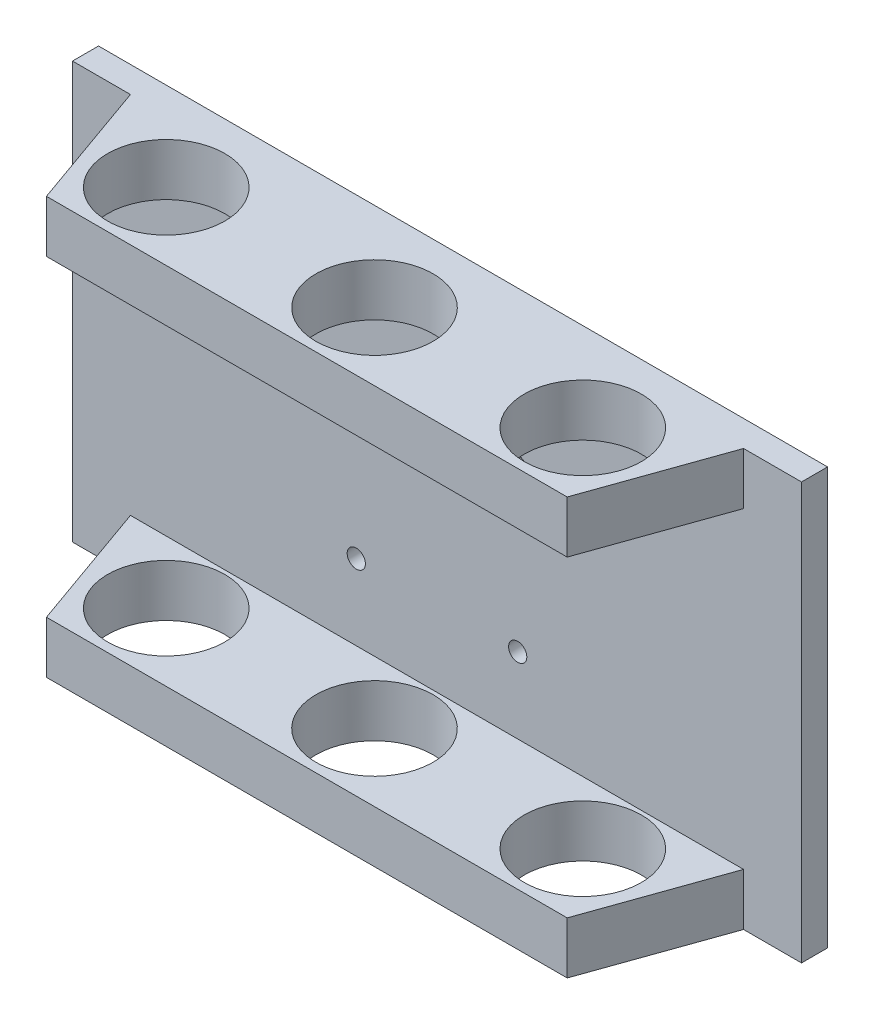
ISO-10303-21;
HEADER;
FILE_DESCRIPTION(('STEP AP214'),'2;1');
FILE_NAME('part.step','',(''),(''),'','','');
FILE_SCHEMA(('AUTOMOTIVE_DESIGN { 1 0 10303 214 1 1 1 1 }'));
ENDSEC;
DATA;
#1=APPLICATION_CONTEXT('core data for automotive mechanical design processes');
#2=APPLICATION_PROTOCOL_DEFINITION('international standard','automotive_design',2000,#1);
#3=PRODUCT_CONTEXT('',#1,'mechanical');
#4=PRODUCT('Part','Part','',(#3));
#5=PRODUCT_RELATED_PRODUCT_CATEGORY('part','',(#4));
#6=PRODUCT_DEFINITION_FORMATION('','',#4);
#7=PRODUCT_DEFINITION_CONTEXT('part definition',#1,'design');
#8=PRODUCT_DEFINITION('design','',#6,#7);
#9=PRODUCT_DEFINITION_SHAPE('','',#8);
#10=(LENGTH_UNIT() NAMED_UNIT(*) SI_UNIT(.MILLI.,.METRE.));
#11=(NAMED_UNIT(*) PLANE_ANGLE_UNIT() SI_UNIT($,.RADIAN.));
#12=(NAMED_UNIT(*) SI_UNIT($,.STERADIAN.) SOLID_ANGLE_UNIT());
#13=UNCERTAINTY_MEASURE_WITH_UNIT(LENGTH_MEASURE(1.E-05),#10,'distance_accuracy_value','');
#14=(GEOMETRIC_REPRESENTATION_CONTEXT(3) GLOBAL_UNCERTAINTY_ASSIGNED_CONTEXT((#13)) GLOBAL_UNIT_ASSIGNED_CONTEXT((#10,
#11,#12)) REPRESENTATION_CONTEXT('',''));
#15=CARTESIAN_POINT('',(0.,0.,0.));
#16=DIRECTION('',(0.,0.,1.));
#17=DIRECTION('',(1.,0.,0.));
#18=AXIS2_PLACEMENT_3D('',#15,#16,#17);
#19=CARTESIAN_POINT('',(-58.8704428508277,40.,2.5));
#20=DIRECTION('',(0.942433981333978,0.,-0.334392270884043));
#21=DIRECTION('',(-0.334392270884043,0.,-0.942433981333978));
#22=AXIS2_PLACEMENT_3D('',#19,#20,#21);
#23=PLANE('',#22);
#24=DIRECTION('',(0.,-1.,0.));
#25=VECTOR('',#24,1.);
#26=CARTESIAN_POINT('',(-58.8704428508277,40.,2.5));
#27=LINE('',#26,#25);
#28=CARTESIAN_POINT('',(-58.8704428508277,40.,2.5));
#29=VERTEX_POINT('',#28);
#30=CARTESIAN_POINT('',(-58.8704428508277,30.,2.5));
#31=VERTEX_POINT('',#30);
#32=EDGE_CURVE('E183',#29,#31,#27,.T.);
#33=ORIENTED_EDGE('',*,*,#32,.T.);
#34=DIRECTION('',(0.334392270884043,0.,0.942433981333978));
#35=VECTOR('',#34,1.);
#36=CARTESIAN_POINT('',(-58.8704428508277,30.,2.5));
#37=LINE('',#36,#35);
#38=CARTESIAN_POINT('',(-50.,30.,27.5));
#39=VERTEX_POINT('',#38);
#40=EDGE_CURVE('E238',#31,#39,#37,.T.);
#41=ORIENTED_EDGE('',*,*,#40,.T.);
#42=DIRECTION('',(0.,-1.,0.));
#43=VECTOR('',#42,1.);
#44=CARTESIAN_POINT('',(-50.,40.,27.5));
#45=LINE('',#44,#43);
#46=CARTESIAN_POINT('',(-50.,40.,27.5));
#47=VERTEX_POINT('',#46);
#48=EDGE_CURVE('E180',#47,#39,#45,.T.);
#49=ORIENTED_EDGE('',*,*,#48,.F.);
#50=DIRECTION('',(0.334392270884043,0.,0.942433981333978));
#51=VECTOR('',#50,1.);
#52=CARTESIAN_POINT('',(-58.8704428508277,40.,2.5));
#53=LINE('',#52,#51);
#54=EDGE_CURVE('E130',#29,#47,#53,.T.);
#55=ORIENTED_EDGE('',*,*,#54,.F.);
#56=EDGE_LOOP('',(#33,#41,#49,#55));
#57=FACE_BOUND('',#56,.T.);
#58=ADVANCED_FACE('F41',(#57),#23,.F.);
#59=CARTESIAN_POINT('',(50.,40.,27.5));
#60=DIRECTION('',(0.,0.,-1.));
#61=DIRECTION('',(-1.,0.,0.));
#62=AXIS2_PLACEMENT_3D('',#59,#60,#61);
#63=PLANE('',#62);
#64=ORIENTED_EDGE('',*,*,#48,.T.);
#65=DIRECTION('',(-1.,0.,0.));
#66=VECTOR('',#65,1.);
#67=CARTESIAN_POINT('',(70.,30.,27.5));
#68=LINE('',#67,#66);
#69=CARTESIAN_POINT('',(50.,30.,27.5));
#70=VERTEX_POINT('',#69);
#71=EDGE_CURVE('E141',#70,#39,#68,.T.);
#72=ORIENTED_EDGE('',*,*,#71,.F.);
#73=DIRECTION('',(0.,-1.,0.));
#74=VECTOR('',#73,1.);
#75=CARTESIAN_POINT('',(50.,40.,27.5));
#76=LINE('',#75,#74);
#77=CARTESIAN_POINT('',(50.,40.,27.5));
#78=VERTEX_POINT('',#77);
#79=EDGE_CURVE('E137',#78,#70,#76,.T.);
#80=ORIENTED_EDGE('',*,*,#79,.F.);
#81=DIRECTION('',(1.,0.,0.));
#82=VECTOR('',#81,1.);
#83=CARTESIAN_POINT('',(50.,40.,27.5));
#84=LINE('',#83,#82);
#85=EDGE_CURVE('E122',#47,#78,#84,.T.);
#86=ORIENTED_EDGE('',*,*,#85,.F.);
#87=EDGE_LOOP('',(#64,#72,#80,#86));
#88=FACE_BOUND('',#87,.T.);
#89=ADVANCED_FACE('F138',(#88),#63,.F.);
#90=CARTESIAN_POINT('',(58.8704428508277,40.,2.5));
#91=DIRECTION('',(-0.942433981333978,0.,-0.334392270884043));
#92=DIRECTION('',(-0.334392270884043,0.,0.942433981333978));
#93=AXIS2_PLACEMENT_3D('',#90,#91,#92);
#94=PLANE('',#93);
#95=ORIENTED_EDGE('',*,*,#79,.T.);
#96=DIRECTION('',(0.334392270884043,0.,-0.942433981333978));
#97=VECTOR('',#96,1.);
#98=CARTESIAN_POINT('',(58.8704428508277,30.,2.5));
#99=LINE('',#98,#97);
#100=CARTESIAN_POINT('',(58.8704428508277,30.,2.5));
#101=VERTEX_POINT('',#100);
#102=EDGE_CURVE('E236',#70,#101,#99,.T.);
#103=ORIENTED_EDGE('',*,*,#102,.T.);
#104=DIRECTION('',(0.,-1.,0.));
#105=VECTOR('',#104,1.);
#106=CARTESIAN_POINT('',(58.8704428508277,40.,2.5));
#107=LINE('',#106,#105);
#108=CARTESIAN_POINT('',(58.8704428508277,40.,2.5));
#109=VERTEX_POINT('',#108);
#110=EDGE_CURVE('E149',#109,#101,#107,.T.);
#111=ORIENTED_EDGE('',*,*,#110,.F.);
#112=DIRECTION('',(0.334392270884043,0.,-0.942433981333978));
#113=VECTOR('',#112,1.);
#114=CARTESIAN_POINT('',(58.8704428508277,40.,2.5));
#115=LINE('',#114,#113);
#116=EDGE_CURVE('E127',#78,#109,#115,.T.);
#117=ORIENTED_EDGE('',*,*,#116,.F.);
#118=EDGE_LOOP('',(#95,#103,#111,#117));
#119=FACE_BOUND('',#118,.T.);
#120=ADVANCED_FACE('F147',(#119),#94,.F.);
#121=CARTESIAN_POINT('',(0.,40.,14.5));
#122=DIRECTION('',(0.,-1.,0.));
#123=DIRECTION('',(0.,0.,-1.));
#124=AXIS2_PLACEMENT_3D('',#121,#122,#123);
#125=CYLINDRICAL_SURFACE('',#124,11.25);
#126=CARTESIAN_POINT('',(0.,30.,14.5));
#127=DIRECTION('',(0.,1.,0.));
#128=DIRECTION('',(0.,0.,1.));
#129=AXIS2_PLACEMENT_3D('',#126,#127,#128);
#130=CIRCLE('',#129,11.25);
#131=CARTESIAN_POINT('',(0.,30.,25.75));
#132=VERTEX_POINT('',#131);
#133=EDGE_CURVE('E233',#132,#132,#130,.T.);
#134=ORIENTED_EDGE('',*,*,#133,.F.);
#135=EDGE_LOOP('',(#134));
#136=FACE_BOUND('',#135,.T.);
#137=CARTESIAN_POINT('',(0.,40.,14.5));
#138=DIRECTION('',(0.,1.,0.));
#139=DIRECTION('',(0.,0.,1.));
#140=AXIS2_PLACEMENT_3D('',#137,#138,#139);
#141=CIRCLE('',#140,11.25);
#142=CARTESIAN_POINT('',(0.,40.,25.75));
#143=VERTEX_POINT('',#142);
#144=EDGE_CURVE('E157',#143,#143,#141,.T.);
#145=ORIENTED_EDGE('',*,*,#144,.T.);
#146=EDGE_LOOP('',(#145));
#147=FACE_BOUND('',#146,.T.);
#148=ADVANCED_FACE('F359',(#136,#147),#125,.F.);
#149=CARTESIAN_POINT('',(40.,40.,14.5));
#150=DIRECTION('',(0.,-1.,0.));
#151=DIRECTION('',(0.,0.,-1.));
#152=AXIS2_PLACEMENT_3D('',#149,#150,#151);
#153=CYLINDRICAL_SURFACE('',#152,11.25);
#154=CARTESIAN_POINT('',(40.,30.,14.5));
#155=DIRECTION('',(0.,1.,0.));
#156=DIRECTION('',(0.,0.,1.));
#157=AXIS2_PLACEMENT_3D('',#154,#155,#156);
#158=CIRCLE('',#157,11.25);
#159=CARTESIAN_POINT('',(40.,30.,25.75));
#160=VERTEX_POINT('',#159);
#161=EDGE_CURVE('E197',#160,#160,#158,.T.);
#162=ORIENTED_EDGE('',*,*,#161,.F.);
#163=EDGE_LOOP('',(#162));
#164=FACE_BOUND('',#163,.T.);
#165=CARTESIAN_POINT('',(40.,40.,14.5));
#166=DIRECTION('',(0.,1.,0.));
#167=DIRECTION('',(0.,0.,1.));
#168=AXIS2_PLACEMENT_3D('',#165,#166,#167);
#169=CIRCLE('',#168,11.25);
#170=CARTESIAN_POINT('',(40.,40.,25.75));
#171=VERTEX_POINT('',#170);
#172=EDGE_CURVE('E248',#171,#171,#169,.T.);
#173=ORIENTED_EDGE('',*,*,#172,.T.);
#174=EDGE_LOOP('',(#173));
#175=FACE_BOUND('',#174,.T.);
#176=ADVANCED_FACE('F364',(#164,#175),#153,.F.);
#177=CARTESIAN_POINT('',(-40.,40.,14.5));
#178=DIRECTION('',(0.,-1.,0.));
#179=DIRECTION('',(0.,0.,-1.));
#180=AXIS2_PLACEMENT_3D('',#177,#178,#179);
#181=CYLINDRICAL_SURFACE('',#180,11.25);
#182=CARTESIAN_POINT('',(-40.,30.,14.5));
#183=DIRECTION('',(0.,1.,0.));
#184=DIRECTION('',(0.,0.,1.));
#185=AXIS2_PLACEMENT_3D('',#182,#183,#184);
#186=CIRCLE('',#185,11.25);
#187=CARTESIAN_POINT('',(-40.,30.,25.75));
#188=VERTEX_POINT('',#187);
#189=EDGE_CURVE('E194',#188,#188,#186,.T.);
#190=ORIENTED_EDGE('',*,*,#189,.F.);
#191=EDGE_LOOP('',(#190));
#192=FACE_BOUND('',#191,.T.);
#193=CARTESIAN_POINT('',(-40.,40.,14.5));
#194=DIRECTION('',(0.,1.,0.));
#195=DIRECTION('',(0.,0.,-1.));
#196=AXIS2_PLACEMENT_3D('',#193,#194,#195);
#197=CIRCLE('',#196,11.25);
#198=CARTESIAN_POINT('',(-40.,40.,3.24999999999998));
#199=VERTEX_POINT('',#198);
#200=EDGE_CURVE('E242',#199,#199,#197,.T.);
#201=ORIENTED_EDGE('',*,*,#200,.T.);
#202=EDGE_LOOP('',(#201));
#203=FACE_BOUND('',#202,.T.);
#204=ADVANCED_FACE('F354',(#192,#203),#181,.F.);
#205=CARTESIAN_POINT('',(0.,40.,0.));
#206=DIRECTION('',(0.,-1.,0.));
#207=DIRECTION('',(0.,0.,-1.));
#208=AXIS2_PLACEMENT_3D('',#205,#206,#207);
#209=PLANE('',#208);
#210=DIRECTION('',(0.,0.,-1.));
#211=VECTOR('',#210,1.);
#212=CARTESIAN_POINT('',(70.,40.,2.5));
#213=LINE('',#212,#211);
#214=CARTESIAN_POINT('',(70.,40.,2.5));
#215=VERTEX_POINT('',#214);
#216=CARTESIAN_POINT('',(70.,40.,-2.5));
#217=VERTEX_POINT('',#216);
#218=EDGE_CURVE('E176',#215,#217,#213,.T.);
#219=ORIENTED_EDGE('',*,*,#218,.T.);
#220=DIRECTION('',(-1.,0.,0.));
#221=VECTOR('',#220,1.);
#222=CARTESIAN_POINT('',(-70.,40.,-2.5));
#223=LINE('',#222,#221);
#224=CARTESIAN_POINT('',(-70.,40.,-2.5));
#225=VERTEX_POINT('',#224);
#226=EDGE_CURVE('E107',#217,#225,#223,.T.);
#227=ORIENTED_EDGE('',*,*,#226,.T.);
#228=DIRECTION('',(0.,0.,1.));
#229=VECTOR('',#228,1.);
#230=CARTESIAN_POINT('',(-70.,40.,2.5));
#231=LINE('',#230,#229);
#232=CARTESIAN_POINT('',(-70.,40.,2.5));
#233=VERTEX_POINT('',#232);
#234=EDGE_CURVE('E260',#225,#233,#231,.T.);
#235=ORIENTED_EDGE('',*,*,#234,.T.);
#236=DIRECTION('',(1.,0.,0.));
#237=VECTOR('',#236,1.);
#238=CARTESIAN_POINT('',(-70.,40.,2.5));
#239=LINE('',#238,#237);
#240=EDGE_CURVE('E262',#233,#29,#239,.T.);
#241=ORIENTED_EDGE('',*,*,#240,.T.);
#242=ORIENTED_EDGE('',*,*,#54,.T.);
#243=ORIENTED_EDGE('',*,*,#85,.T.);
#244=ORIENTED_EDGE('',*,*,#116,.T.);
#245=DIRECTION('',(1.,0.,0.));
#246=VECTOR('',#245,1.);
#247=CARTESIAN_POINT('',(58.8704428508277,40.,2.5));
#248=LINE('',#247,#246);
#249=EDGE_CURVE('E67',#109,#215,#248,.T.);
#250=ORIENTED_EDGE('',*,*,#249,.T.);
#251=EDGE_LOOP('',(#219,#227,#235,#241,#242,#243,#244,#250));
#252=FACE_BOUND('',#251,.T.);
#253=ORIENTED_EDGE('',*,*,#144,.F.);
#254=EDGE_LOOP('',(#253));
#255=FACE_BOUND('',#254,.T.);
#256=ORIENTED_EDGE('',*,*,#172,.F.);
#257=EDGE_LOOP('',(#256));
#258=FACE_BOUND('',#257,.T.);
#259=ORIENTED_EDGE('',*,*,#200,.F.);
#260=EDGE_LOOP('',(#259));
#261=FACE_BOUND('',#260,.T.);
#262=ADVANCED_FACE('F124',(#252,#255,#258,#261),#209,.F.);
#263=CARTESIAN_POINT('',(0.,-40.,0.));
#264=DIRECTION('',(0.,-1.,0.));
#265=DIRECTION('',(0.,0.,-1.));
#266=AXIS2_PLACEMENT_3D('',#263,#264,#265);
#267=PLANE('',#266);
#268=CARTESIAN_POINT('',(40.,-40.,14.5));
#269=DIRECTION('',(0.,1.,0.));
#270=DIRECTION('',(0.,0.,1.));
#271=AXIS2_PLACEMENT_3D('',#268,#269,#270);
#272=CIRCLE('',#271,11.25);
#273=CARTESIAN_POINT('',(40.,-40.,25.75));
#274=VERTEX_POINT('',#273);
#275=EDGE_CURVE('E245',#274,#274,#272,.T.);
#276=ORIENTED_EDGE('',*,*,#275,.T.);
#277=EDGE_LOOP('',(#276));
#278=FACE_BOUND('',#277,.T.);
#279=DIRECTION('',(0.,0.,-1.));
#280=VECTOR('',#279,1.);
#281=CARTESIAN_POINT('',(70.,-40.,2.5));
#282=LINE('',#281,#280);
#283=CARTESIAN_POINT('',(70.,-40.,2.5));
#284=VERTEX_POINT('',#283);
#285=CARTESIAN_POINT('',(70.,-40.,-2.5));
#286=VERTEX_POINT('',#285);
#287=EDGE_CURVE('E154',#284,#286,#282,.T.);
#288=ORIENTED_EDGE('',*,*,#287,.F.);
#289=DIRECTION('',(1.,0.,0.));
#290=VECTOR('',#289,1.);
#291=CARTESIAN_POINT('',(58.8704428508277,-40.,2.5));
#292=LINE('',#291,#290);
#293=CARTESIAN_POINT('',(58.8704428508277,-40.,2.5));
#294=VERTEX_POINT('',#293);
#295=EDGE_CURVE('E174',#294,#284,#292,.T.);
#296=ORIENTED_EDGE('',*,*,#295,.F.);
#297=DIRECTION('',(0.334392270884043,0.,-0.942433981333978));
#298=VECTOR('',#297,1.);
#299=CARTESIAN_POINT('',(58.8704428508277,-40.,2.5));
#300=LINE('',#299,#298);
#301=CARTESIAN_POINT('',(50.,-40.,27.5));
#302=VERTEX_POINT('',#301);
#303=EDGE_CURVE('E171',#302,#294,#300,.T.);
#304=ORIENTED_EDGE('',*,*,#303,.F.);
#305=DIRECTION('',(1.,0.,0.));
#306=VECTOR('',#305,1.);
#307=CARTESIAN_POINT('',(50.,-40.,27.5));
#308=LINE('',#307,#306);
#309=CARTESIAN_POINT('',(-50.,-40.,27.5));
#310=VERTEX_POINT('',#309);
#311=EDGE_CURVE('E168',#310,#302,#308,.T.);
#312=ORIENTED_EDGE('',*,*,#311,.F.);
#313=DIRECTION('',(0.334392270884043,0.,0.942433981333978));
#314=VECTOR('',#313,1.);
#315=CARTESIAN_POINT('',(-58.8704428508277,-40.,2.5));
#316=LINE('',#315,#314);
#317=CARTESIAN_POINT('',(-58.8704428508277,-40.,2.5));
#318=VERTEX_POINT('',#317);
#319=EDGE_CURVE('E165',#318,#310,#316,.T.);
#320=ORIENTED_EDGE('',*,*,#319,.F.);
#321=DIRECTION('',(1.,0.,0.));
#322=VECTOR('',#321,1.);
#323=CARTESIAN_POINT('',(-70.,-40.,2.5));
#324=LINE('',#323,#322);
#325=CARTESIAN_POINT('',(-70.,-40.,2.5));
#326=VERTEX_POINT('',#325);
#327=EDGE_CURVE('E162',#326,#318,#324,.T.);
#328=ORIENTED_EDGE('',*,*,#327,.F.);
#329=DIRECTION('',(0.,0.,1.));
#330=VECTOR('',#329,1.);
#331=CARTESIAN_POINT('',(-70.,-40.,2.5));
#332=LINE('',#331,#330);
#333=CARTESIAN_POINT('',(-70.,-40.,-2.5));
#334=VERTEX_POINT('',#333);
#335=EDGE_CURVE('E159',#334,#326,#332,.T.);
#336=ORIENTED_EDGE('',*,*,#335,.F.);
#337=DIRECTION('',(-1.,0.,0.));
#338=VECTOR('',#337,1.);
#339=CARTESIAN_POINT('',(-70.,-40.,-2.5));
#340=LINE('',#339,#338);
#341=EDGE_CURVE('E156',#286,#334,#340,.T.);
#342=ORIENTED_EDGE('',*,*,#341,.F.);
#343=EDGE_LOOP('',(#288,#296,#304,#312,#320,#328,#336,#342));
#344=FACE_BOUND('',#343,.T.);
#345=CARTESIAN_POINT('',(0.,-40.,14.5));
#346=DIRECTION('',(0.,1.,0.));
#347=DIRECTION('',(0.,0.,1.));
#348=AXIS2_PLACEMENT_3D('',#345,#346,#347);
#349=CIRCLE('',#348,11.25);
#350=CARTESIAN_POINT('',(0.,-40.,25.75));
#351=VERTEX_POINT('',#350);
#352=EDGE_CURVE('E251',#351,#351,#349,.T.);
#353=ORIENTED_EDGE('',*,*,#352,.T.);
#354=EDGE_LOOP('',(#353));
#355=FACE_BOUND('',#354,.T.);
#356=CARTESIAN_POINT('',(-40.,-40.,14.5));
#357=DIRECTION('',(0.,1.,0.));
#358=DIRECTION('',(0.,0.,-1.));
#359=AXIS2_PLACEMENT_3D('',#356,#357,#358);
#360=CIRCLE('',#359,11.25);
#361=CARTESIAN_POINT('',(-40.,-40.,3.24999999999998));
#362=VERTEX_POINT('',#361);
#363=EDGE_CURVE('E241',#362,#362,#360,.T.);
#364=ORIENTED_EDGE('',*,*,#363,.T.);
#365=EDGE_LOOP('',(#364));
#366=FACE_BOUND('',#365,.T.);
#367=ADVANCED_FACE('F296',(#278,#344,#355,#366),#267,.T.);
#368=CARTESIAN_POINT('',(70.,40.,2.5));
#369=DIRECTION('',(-1.,0.,0.));
#370=DIRECTION('',(0.,0.,1.));
#371=AXIS2_PLACEMENT_3D('',#368,#369,#370);
#372=PLANE('',#371);
#373=ORIENTED_EDGE('',*,*,#287,.T.);
#374=DIRECTION('',(0.,-1.,0.));
#375=VECTOR('',#374,1.);
#376=CARTESIAN_POINT('',(70.,40.,-2.5));
#377=LINE('',#376,#375);
#378=EDGE_CURVE('E11',#217,#286,#377,.T.);
#379=ORIENTED_EDGE('',*,*,#378,.F.);
#380=ORIENTED_EDGE('',*,*,#218,.F.);
#381=DIRECTION('',(0.,-1.,0.));
#382=VECTOR('',#381,1.);
#383=CARTESIAN_POINT('',(70.,40.,2.5));
#384=LINE('',#383,#382);
#385=EDGE_CURVE('E99',#215,#284,#384,.T.);
#386=ORIENTED_EDGE('',*,*,#385,.T.);
#387=EDGE_LOOP('',(#373,#379,#380,#386));
#388=FACE_BOUND('',#387,.T.);
#389=ADVANCED_FACE('F43',(#388),#372,.F.);
#390=CARTESIAN_POINT('',(-70.,40.,-2.5));
#391=DIRECTION('',(0.,0.,1.));
#392=DIRECTION('',(1.,0.,0.));
#393=AXIS2_PLACEMENT_3D('',#390,#391,#392);
#394=PLANE('',#393);
#395=CARTESIAN_POINT('',(15.5,15.5,-2.5));
#396=DIRECTION('',(0.,0.,-1.));
#397=DIRECTION('',(-1.,0.,0.));
#398=AXIS2_PLACEMENT_3D('',#395,#396,#397);
#399=CIRCLE('',#398,1.75);
#400=CARTESIAN_POINT('',(13.75,15.5,-2.5));
#401=VERTEX_POINT('',#400);
#402=EDGE_CURVE('E307',#401,#401,#399,.T.);
#403=ORIENTED_EDGE('',*,*,#402,.F.);
#404=EDGE_LOOP('',(#403));
#405=FACE_BOUND('',#404,.T.);
#406=CARTESIAN_POINT('',(-15.5,-15.5,-2.5));
#407=DIRECTION('',(0.,0.,-1.));
#408=DIRECTION('',(-1.,0.,0.));
#409=AXIS2_PLACEMENT_3D('',#406,#407,#408);
#410=CIRCLE('',#409,1.75);
#411=CARTESIAN_POINT('',(-17.25,-15.5,-2.5));
#412=VERTEX_POINT('',#411);
#413=EDGE_CURVE('E308',#412,#412,#410,.T.);
#414=ORIENTED_EDGE('',*,*,#413,.F.);
#415=EDGE_LOOP('',(#414));
#416=FACE_BOUND('',#415,.T.);
#417=CARTESIAN_POINT('',(15.5,-15.5,-2.5));
#418=DIRECTION('',(0.,0.,-1.));
#419=DIRECTION('',(-1.,0.,0.));
#420=AXIS2_PLACEMENT_3D('',#417,#418,#419);
#421=CIRCLE('',#420,1.75);
#422=CARTESIAN_POINT('',(13.75,-15.5,-2.5));
#423=VERTEX_POINT('',#422);
#424=EDGE_CURVE('E311',#423,#423,#421,.T.);
#425=ORIENTED_EDGE('',*,*,#424,.F.);
#426=EDGE_LOOP('',(#425));
#427=FACE_BOUND('',#426,.T.);
#428=CARTESIAN_POINT('',(-15.5,15.5,-2.5));
#429=DIRECTION('',(0.,0.,-1.));
#430=DIRECTION('',(-1.,0.,0.));
#431=AXIS2_PLACEMENT_3D('',#428,#429,#430);
#432=CIRCLE('',#431,1.75);
#433=CARTESIAN_POINT('',(-17.25,15.5,-2.5));
#434=VERTEX_POINT('',#433);
#435=EDGE_CURVE('E203',#434,#434,#432,.T.);
#436=ORIENTED_EDGE('',*,*,#435,.F.);
#437=EDGE_LOOP('',(#436));
#438=FACE_BOUND('',#437,.T.);
#439=ORIENTED_EDGE('',*,*,#341,.T.);
#440=DIRECTION('',(0.,-1.,0.));
#441=VECTOR('',#440,1.);
#442=CARTESIAN_POINT('',(-70.,40.,-2.5));
#443=LINE('',#442,#441);
#444=EDGE_CURVE('E50',#225,#334,#443,.T.);
#445=ORIENTED_EDGE('',*,*,#444,.F.);
#446=ORIENTED_EDGE('',*,*,#226,.F.);
#447=ORIENTED_EDGE('',*,*,#378,.T.);
#448=EDGE_LOOP('',(#439,#445,#446,#447));
#449=FACE_BOUND('',#448,.T.);
#450=ADVANCED_FACE('F320',(#405,#416,#427,#438,#449),#394,.F.);
#451=CARTESIAN_POINT('',(-70.,40.,2.5));
#452=DIRECTION('',(1.,0.,0.));
#453=DIRECTION('',(0.,0.,-1.));
#454=AXIS2_PLACEMENT_3D('',#451,#452,#453);
#455=PLANE('',#454);
#456=ORIENTED_EDGE('',*,*,#335,.T.);
#457=DIRECTION('',(0.,-1.,0.));
#458=VECTOR('',#457,1.);
#459=CARTESIAN_POINT('',(-70.,40.,2.5));
#460=LINE('',#459,#458);
#461=EDGE_CURVE('E186',#233,#326,#460,.T.);
#462=ORIENTED_EDGE('',*,*,#461,.F.);
#463=ORIENTED_EDGE('',*,*,#234,.F.);
#464=ORIENTED_EDGE('',*,*,#444,.T.);
#465=EDGE_LOOP('',(#456,#462,#463,#464));
#466=FACE_BOUND('',#465,.T.);
#467=ADVANCED_FACE('F323',(#466),#455,.F.);
#468=CARTESIAN_POINT('',(-50.,-30.,27.5));
#469=VERTEX_POINT('',#468);
#470=EDGE_CURVE('E144',#469,#310,#45,.T.);
#471=ORIENTED_EDGE('',*,*,#470,.F.);
#472=DIRECTION('',(-0.334392270884043,0.,-0.942433981333978));
#473=VECTOR('',#472,1.);
#474=CARTESIAN_POINT('',(-58.8704428508277,-30.,2.5));
#475=LINE('',#474,#473);
#476=CARTESIAN_POINT('',(-58.8704428508277,-30.,2.5));
#477=VERTEX_POINT('',#476);
#478=EDGE_CURVE('E198',#469,#477,#475,.T.);
#479=ORIENTED_EDGE('',*,*,#478,.T.);
#480=EDGE_CURVE('E182',#477,#318,#27,.T.);
#481=ORIENTED_EDGE('',*,*,#480,.T.);
#482=ORIENTED_EDGE('',*,*,#319,.T.);
#483=EDGE_LOOP('',(#471,#479,#481,#482));
#484=FACE_BOUND('',#483,.T.);
#485=ADVANCED_FACE('F289',(#484),#23,.F.);
#486=CARTESIAN_POINT('',(50.,-30.,27.5));
#487=VERTEX_POINT('',#486);
#488=EDGE_CURVE('E145',#487,#302,#76,.T.);
#489=ORIENTED_EDGE('',*,*,#488,.F.);
#490=DIRECTION('',(-1.,0.,0.));
#491=VECTOR('',#490,1.);
#492=CARTESIAN_POINT('',(70.,-30.,27.5));
#493=LINE('',#492,#491);
#494=EDGE_CURVE('E217',#487,#469,#493,.T.);
#495=ORIENTED_EDGE('',*,*,#494,.T.);
#496=ORIENTED_EDGE('',*,*,#470,.T.);
#497=ORIENTED_EDGE('',*,*,#311,.T.);
#498=EDGE_LOOP('',(#489,#495,#496,#497));
#499=FACE_BOUND('',#498,.T.);
#500=ADVANCED_FACE('F302',(#499),#63,.F.);
#501=CARTESIAN_POINT('',(58.8704428508277,-30.,2.5));
#502=VERTEX_POINT('',#501);
#503=EDGE_CURVE('E178',#502,#294,#107,.T.);
#504=ORIENTED_EDGE('',*,*,#503,.F.);
#505=DIRECTION('',(-0.334392270884043,0.,0.942433981333978));
#506=VECTOR('',#505,1.);
#507=CARTESIAN_POINT('',(58.8704428508277,-30.,2.5));
#508=LINE('',#507,#506);
#509=EDGE_CURVE('E226',#502,#487,#508,.T.);
#510=ORIENTED_EDGE('',*,*,#509,.T.);
#511=ORIENTED_EDGE('',*,*,#488,.T.);
#512=ORIENTED_EDGE('',*,*,#303,.T.);
#513=EDGE_LOOP('',(#504,#510,#511,#512));
#514=FACE_BOUND('',#513,.T.);
#515=ADVANCED_FACE('F342',(#514),#94,.F.);
#516=CARTESIAN_POINT('',(58.8704428508277,40.,2.5));
#517=DIRECTION('',(0.,0.,-1.));
#518=DIRECTION('',(-1.,0.,0.));
#519=AXIS2_PLACEMENT_3D('',#516,#517,#518);
#520=PLANE('',#519);
#521=CARTESIAN_POINT('',(15.5,15.5,2.5));
#522=DIRECTION('',(0.,0.,-1.));
#523=DIRECTION('',(-1.,0.,0.));
#524=AXIS2_PLACEMENT_3D('',#521,#522,#523);
#525=CIRCLE('',#524,1.75);
#526=CARTESIAN_POINT('',(13.75,15.5,2.5));
#527=VERTEX_POINT('',#526);
#528=EDGE_CURVE('E45',#527,#527,#525,.T.);
#529=ORIENTED_EDGE('',*,*,#528,.T.);
#530=EDGE_LOOP('',(#529));
#531=FACE_BOUND('',#530,.T.);
#532=CARTESIAN_POINT('',(-15.5,-15.5,2.5));
#533=DIRECTION('',(0.,0.,-1.));
#534=DIRECTION('',(-1.,0.,0.));
#535=AXIS2_PLACEMENT_3D('',#532,#533,#534);
#536=CIRCLE('',#535,1.75);
#537=CARTESIAN_POINT('',(-17.25,-15.5,2.5));
#538=VERTEX_POINT('',#537);
#539=EDGE_CURVE('E205',#538,#538,#536,.T.);
#540=ORIENTED_EDGE('',*,*,#539,.T.);
#541=EDGE_LOOP('',(#540));
#542=FACE_BOUND('',#541,.T.);
#543=CARTESIAN_POINT('',(15.5,-15.5,2.5));
#544=DIRECTION('',(0.,0.,-1.));
#545=DIRECTION('',(-1.,0.,0.));
#546=AXIS2_PLACEMENT_3D('',#543,#544,#545);
#547=CIRCLE('',#546,1.75);
#548=CARTESIAN_POINT('',(13.75,-15.5,2.5));
#549=VERTEX_POINT('',#548);
#550=EDGE_CURVE('E202',#549,#549,#547,.T.);
#551=ORIENTED_EDGE('',*,*,#550,.T.);
#552=EDGE_LOOP('',(#551));
#553=FACE_BOUND('',#552,.T.);
#554=CARTESIAN_POINT('',(-15.5,15.5,2.5));
#555=DIRECTION('',(0.,0.,-1.));
#556=DIRECTION('',(-1.,0.,0.));
#557=AXIS2_PLACEMENT_3D('',#554,#555,#556);
#558=CIRCLE('',#557,1.75);
#559=CARTESIAN_POINT('',(-17.25,15.5,2.5));
#560=VERTEX_POINT('',#559);
#561=EDGE_CURVE('E199',#560,#560,#558,.T.);
#562=ORIENTED_EDGE('',*,*,#561,.T.);
#563=EDGE_LOOP('',(#562));
#564=FACE_BOUND('',#563,.T.);
#565=ORIENTED_EDGE('',*,*,#295,.T.);
#566=ORIENTED_EDGE('',*,*,#385,.F.);
#567=ORIENTED_EDGE('',*,*,#249,.F.);
#568=ORIENTED_EDGE('',*,*,#110,.T.);
#569=DIRECTION('',(-1.,0.,0.));
#570=VECTOR('',#569,1.);
#571=CARTESIAN_POINT('',(70.,30.,2.5));
#572=LINE('',#571,#570);
#573=EDGE_CURVE('E210',#101,#31,#572,.T.);
#574=ORIENTED_EDGE('',*,*,#573,.T.);
#575=ORIENTED_EDGE('',*,*,#32,.F.);
#576=ORIENTED_EDGE('',*,*,#240,.F.);
#577=ORIENTED_EDGE('',*,*,#461,.T.);
#578=ORIENTED_EDGE('',*,*,#327,.T.);
#579=ORIENTED_EDGE('',*,*,#480,.F.);
#580=DIRECTION('',(-1.,0.,0.));
#581=VECTOR('',#580,1.);
#582=CARTESIAN_POINT('',(70.,-30.,2.5));
#583=LINE('',#582,#581);
#584=EDGE_CURVE('E58',#502,#477,#583,.T.);
#585=ORIENTED_EDGE('',*,*,#584,.F.);
#586=ORIENTED_EDGE('',*,*,#503,.T.);
#587=EDGE_LOOP('',(#565,#566,#567,#568,#574,#575,#576,#577,#578,#579,#585,#586));
#588=FACE_BOUND('',#587,.T.);
#589=ADVANCED_FACE('F266',(#531,#542,#553,#564,#588),#520,.F.);
#590=CARTESIAN_POINT('',(0.,-30.,14.5));
#591=DIRECTION('',(0.,-1.,0.));
#592=DIRECTION('',(0.,0.,-1.));
#593=AXIS2_PLACEMENT_3D('',#590,#591,#592);
#594=CIRCLE('',#593,11.25);
#595=CARTESIAN_POINT('',(0.,-30.,3.24999999999998));
#596=VERTEX_POINT('',#595);
#597=EDGE_CURVE('E223',#596,#596,#594,.T.);
#598=ORIENTED_EDGE('',*,*,#597,.F.);
#599=EDGE_LOOP('',(#598));
#600=FACE_BOUND('',#599,.T.);
#601=ORIENTED_EDGE('',*,*,#352,.F.);
#602=EDGE_LOOP('',(#601));
#603=FACE_BOUND('',#602,.T.);
#604=ADVANCED_FACE('F348',(#600,#603),#125,.F.);
#605=CARTESIAN_POINT('',(40.,-30.,14.5));
#606=DIRECTION('',(0.,-1.,0.));
#607=DIRECTION('',(0.,0.,-1.));
#608=AXIS2_PLACEMENT_3D('',#605,#606,#607);
#609=CIRCLE('',#608,11.25);
#610=CARTESIAN_POINT('',(40.,-30.,3.24999999999998));
#611=VERTEX_POINT('',#610);
#612=EDGE_CURVE('E193',#611,#611,#609,.T.);
#613=ORIENTED_EDGE('',*,*,#612,.F.);
#614=EDGE_LOOP('',(#613));
#615=FACE_BOUND('',#614,.T.);
#616=ORIENTED_EDGE('',*,*,#275,.F.);
#617=EDGE_LOOP('',(#616));
#618=FACE_BOUND('',#617,.T.);
#619=ADVANCED_FACE('F357',(#615,#618),#153,.F.);
#620=CARTESIAN_POINT('',(-40.,-30.,14.5));
#621=DIRECTION('',(0.,-1.,0.));
#622=DIRECTION('',(0.,0.,-1.));
#623=AXIS2_PLACEMENT_3D('',#620,#621,#622);
#624=CIRCLE('',#623,11.25);
#625=CARTESIAN_POINT('',(-40.,-30.,3.24999999999998));
#626=VERTEX_POINT('',#625);
#627=EDGE_CURVE('E190',#626,#626,#624,.T.);
#628=ORIENTED_EDGE('',*,*,#627,.F.);
#629=EDGE_LOOP('',(#628));
#630=FACE_BOUND('',#629,.T.);
#631=ORIENTED_EDGE('',*,*,#363,.F.);
#632=EDGE_LOOP('',(#631));
#633=FACE_BOUND('',#632,.T.);
#634=ADVANCED_FACE('F362',(#630,#633),#181,.F.);
#635=CARTESIAN_POINT('',(70.,30.,2.5));
#636=DIRECTION('',(0.,1.,0.));
#637=DIRECTION('',(0.,0.,1.));
#638=AXIS2_PLACEMENT_3D('',#635,#636,#637);
#639=PLANE('',#638);
#640=ORIENTED_EDGE('',*,*,#133,.T.);
#641=EDGE_LOOP('',(#640));
#642=FACE_BOUND('',#641,.T.);
#643=ORIENTED_EDGE('',*,*,#161,.T.);
#644=EDGE_LOOP('',(#643));
#645=FACE_BOUND('',#644,.T.);
#646=ORIENTED_EDGE('',*,*,#189,.T.);
#647=EDGE_LOOP('',(#646));
#648=FACE_BOUND('',#647,.T.);
#649=ORIENTED_EDGE('',*,*,#573,.F.);
#650=ORIENTED_EDGE('',*,*,#102,.F.);
#651=ORIENTED_EDGE('',*,*,#71,.T.);
#652=ORIENTED_EDGE('',*,*,#40,.F.);
#653=EDGE_LOOP('',(#649,#650,#651,#652));
#654=FACE_BOUND('',#653,.T.);
#655=ADVANCED_FACE('F367',(#642,#645,#648,#654),#639,.F.);
#656=CARTESIAN_POINT('',(70.,-30.,2.5));
#657=DIRECTION('',(0.,-1.,0.));
#658=DIRECTION('',(0.,0.,-1.));
#659=AXIS2_PLACEMENT_3D('',#656,#657,#658);
#660=PLANE('',#659);
#661=ORIENTED_EDGE('',*,*,#597,.T.);
#662=EDGE_LOOP('',(#661));
#663=FACE_BOUND('',#662,.T.);
#664=ORIENTED_EDGE('',*,*,#612,.T.);
#665=EDGE_LOOP('',(#664));
#666=FACE_BOUND('',#665,.T.);
#667=ORIENTED_EDGE('',*,*,#627,.T.);
#668=EDGE_LOOP('',(#667));
#669=FACE_BOUND('',#668,.T.);
#670=ORIENTED_EDGE('',*,*,#494,.F.);
#671=ORIENTED_EDGE('',*,*,#509,.F.);
#672=ORIENTED_EDGE('',*,*,#584,.T.);
#673=ORIENTED_EDGE('',*,*,#478,.F.);
#674=EDGE_LOOP('',(#670,#671,#672,#673));
#675=FACE_BOUND('',#674,.T.);
#676=ADVANCED_FACE('F284',(#663,#666,#669,#675),#660,.F.);
#677=CARTESIAN_POINT('',(-15.5,15.5,7.5));
#678=DIRECTION('',(0.,0.,-1.));
#679=DIRECTION('',(-1.,0.,0.));
#680=AXIS2_PLACEMENT_3D('',#677,#678,#679);
#681=CYLINDRICAL_SURFACE('',#680,1.75);
#682=ORIENTED_EDGE('',*,*,#435,.T.);
#683=EDGE_LOOP('',(#682));
#684=FACE_BOUND('',#683,.T.);
#685=ORIENTED_EDGE('',*,*,#561,.F.);
#686=EDGE_LOOP('',(#685));
#687=FACE_BOUND('',#686,.T.);
#688=ADVANCED_FACE('F374',(#684,#687),#681,.F.);
#689=CARTESIAN_POINT('',(15.5,-15.5,7.5));
#690=DIRECTION('',(0.,0.,-1.));
#691=DIRECTION('',(-1.,0.,0.));
#692=AXIS2_PLACEMENT_3D('',#689,#690,#691);
#693=CYLINDRICAL_SURFACE('',#692,1.75);
#694=ORIENTED_EDGE('',*,*,#424,.T.);
#695=EDGE_LOOP('',(#694));
#696=FACE_BOUND('',#695,.T.);
#697=ORIENTED_EDGE('',*,*,#550,.F.);
#698=EDGE_LOOP('',(#697));
#699=FACE_BOUND('',#698,.T.);
#700=ADVANCED_FACE('F317',(#696,#699),#693,.F.);
#701=CARTESIAN_POINT('',(-15.5,-15.5,7.5));
#702=DIRECTION('',(0.,0.,-1.));
#703=DIRECTION('',(-1.,0.,0.));
#704=AXIS2_PLACEMENT_3D('',#701,#702,#703);
#705=CYLINDRICAL_SURFACE('',#704,1.75);
#706=ORIENTED_EDGE('',*,*,#413,.T.);
#707=EDGE_LOOP('',(#706));
#708=FACE_BOUND('',#707,.T.);
#709=ORIENTED_EDGE('',*,*,#539,.F.);
#710=EDGE_LOOP('',(#709));
#711=FACE_BOUND('',#710,.T.);
#712=ADVANCED_FACE('F379',(#708,#711),#705,.F.);
#713=CARTESIAN_POINT('',(15.5,15.5,7.5));
#714=DIRECTION('',(0.,0.,-1.));
#715=DIRECTION('',(-1.,0.,0.));
#716=AXIS2_PLACEMENT_3D('',#713,#714,#715);
#717=CYLINDRICAL_SURFACE('',#716,1.75);
#718=ORIENTED_EDGE('',*,*,#402,.T.);
#719=EDGE_LOOP('',(#718));
#720=FACE_BOUND('',#719,.T.);
#721=ORIENTED_EDGE('',*,*,#528,.F.);
#722=EDGE_LOOP('',(#721));
#723=FACE_BOUND('',#722,.T.);
#724=ADVANCED_FACE('F382',(#720,#723),#717,.F.);
#725=CLOSED_SHELL('',(#58,#89,#120,#148,#176,#204,#262,#367,#389,#450,#467,#485,#500,#515,#589,
#604,#619,#634,#655,#676,#688,#700,#712,#724));
#726=MANIFOLD_SOLID_BREP('B2',#725);
#727=ADVANCED_BREP_SHAPE_REPRESENTATION('',(#18,#726),#14);
#728=SHAPE_DEFINITION_REPRESENTATION(#9,#727);
ENDSEC;
END-ISO-10303-21;
